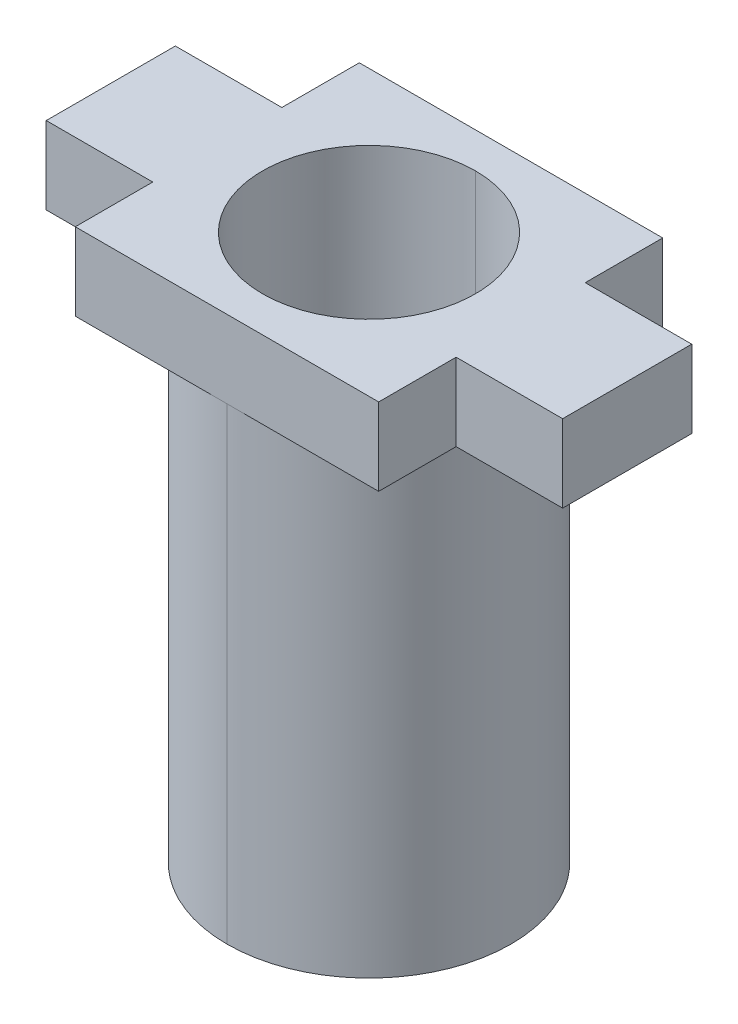
ISO-10303-21;
HEADER;
FILE_DESCRIPTION(('STEP AP214'),'2;1');
FILE_NAME('part.step','',(''),(''),'','','');
FILE_SCHEMA(('AUTOMOTIVE_DESIGN { 1 0 10303 214 1 1 1 1 }'));
ENDSEC;
DATA;
#1=APPLICATION_CONTEXT('core data for automotive mechanical design processes');
#2=APPLICATION_PROTOCOL_DEFINITION('international standard','automotive_design',2000,#1);
#3=PRODUCT_CONTEXT('',#1,'mechanical');
#4=PRODUCT('Part','Part','',(#3));
#5=PRODUCT_RELATED_PRODUCT_CATEGORY('part','',(#4));
#6=PRODUCT_DEFINITION_FORMATION('','',#4);
#7=PRODUCT_DEFINITION_CONTEXT('part definition',#1,'design');
#8=PRODUCT_DEFINITION('design','',#6,#7);
#9=PRODUCT_DEFINITION_SHAPE('','',#8);
#10=(LENGTH_UNIT() NAMED_UNIT(*) SI_UNIT(.MILLI.,.METRE.));
#11=(NAMED_UNIT(*) PLANE_ANGLE_UNIT() SI_UNIT($,.RADIAN.));
#12=(NAMED_UNIT(*) SI_UNIT($,.STERADIAN.) SOLID_ANGLE_UNIT());
#13=UNCERTAINTY_MEASURE_WITH_UNIT(LENGTH_MEASURE(1.E-05),#10,'distance_accuracy_value','');
#14=(GEOMETRIC_REPRESENTATION_CONTEXT(3) GLOBAL_UNCERTAINTY_ASSIGNED_CONTEXT((#13)) GLOBAL_UNIT_ASSIGNED_CONTEXT((#10,
#11,#12)) REPRESENTATION_CONTEXT('',''));
#15=CARTESIAN_POINT('',(0.,0.,0.));
#16=DIRECTION('',(0.,0.,1.));
#17=DIRECTION('',(1.,0.,0.));
#18=AXIS2_PLACEMENT_3D('',#15,#16,#17);
#19=CARTESIAN_POINT('',(-4.,8.45,-1.));
#20=DIRECTION('',(0.,0.,1.));
#21=DIRECTION('',(1.,0.,0.));
#22=AXIS2_PLACEMENT_3D('',#19,#20,#21);
#23=PLANE('',#22);
#24=DIRECTION('',(-1.,0.,0.));
#25=VECTOR('',#24,1.);
#26=CARTESIAN_POINT('',(-4.,7.25,-1.));
#27=LINE('',#26,#25);
#28=CARTESIAN_POINT('',(-2.35,7.25,-1.));
#29=VERTEX_POINT('',#28);
#30=CARTESIAN_POINT('',(-4.,7.25,-1.));
#31=VERTEX_POINT('',#30);
#32=EDGE_CURVE('E320',#29,#31,#27,.T.);
#33=ORIENTED_EDGE('',*,*,#32,.T.);
#34=DIRECTION('',(0.,-1.,0.));
#35=VECTOR('',#34,1.);
#36=CARTESIAN_POINT('',(-4.,8.45,-1.));
#37=LINE('',#36,#35);
#38=CARTESIAN_POINT('',(-4.,8.45,-1.));
#39=VERTEX_POINT('',#38);
#40=EDGE_CURVE('E290',#39,#31,#37,.T.);
#41=ORIENTED_EDGE('',*,*,#40,.F.);
#42=DIRECTION('',(-1.,0.,0.));
#43=VECTOR('',#42,1.);
#44=CARTESIAN_POINT('',(-4.,8.45,-1.));
#45=LINE('',#44,#43);
#46=CARTESIAN_POINT('',(-2.35,8.45,-1.));
#47=VERTEX_POINT('',#46);
#48=EDGE_CURVE('E262',#47,#39,#45,.T.);
#49=ORIENTED_EDGE('',*,*,#48,.F.);
#50=DIRECTION('',(0.,-1.,0.));
#51=VECTOR('',#50,1.);
#52=CARTESIAN_POINT('',(-2.35,8.45,-1.));
#53=LINE('',#52,#51);
#54=EDGE_CURVE('E11',#47,#29,#53,.T.);
#55=ORIENTED_EDGE('',*,*,#54,.T.);
#56=EDGE_LOOP('',(#33,#41,#49,#55));
#57=FACE_BOUND('',#56,.T.);
#58=ADVANCED_FACE('F17',(#57),#23,.F.);
#59=CARTESIAN_POINT('',(-2.35,8.45,-1.));
#60=DIRECTION('',(1.,0.,0.));
#61=DIRECTION('',(0.,1.,0.));
#62=AXIS2_PLACEMENT_3D('',#59,#60,#61);
#63=PLANE('',#62);
#64=DIRECTION('',(0.,0.,1.));
#65=VECTOR('',#64,1.);
#66=CARTESIAN_POINT('',(-2.35,7.25,-1.));
#67=LINE('',#66,#65);
#68=CARTESIAN_POINT('',(-2.35,7.25,-2.2));
#69=VERTEX_POINT('',#68);
#70=EDGE_CURVE('E291',#69,#29,#67,.T.);
#71=ORIENTED_EDGE('',*,*,#70,.T.);
#72=ORIENTED_EDGE('',*,*,#54,.F.);
#73=DIRECTION('',(0.,0.,1.));
#74=VECTOR('',#73,1.);
#75=CARTESIAN_POINT('',(-2.35,8.45,-1.));
#76=LINE('',#75,#74);
#77=CARTESIAN_POINT('',(-2.35,8.45,-2.2));
#78=VERTEX_POINT('',#77);
#79=EDGE_CURVE('E259',#78,#47,#76,.T.);
#80=ORIENTED_EDGE('',*,*,#79,.F.);
#81=DIRECTION('',(0.,-1.,0.));
#82=VECTOR('',#81,1.);
#83=CARTESIAN_POINT('',(-2.35,8.45,-2.2));
#84=LINE('',#83,#82);
#85=EDGE_CURVE('E28',#78,#69,#84,.T.);
#86=ORIENTED_EDGE('',*,*,#85,.T.);
#87=EDGE_LOOP('',(#71,#72,#80,#86));
#88=FACE_BOUND('',#87,.T.);
#89=ADVANCED_FACE('F376',(#88),#63,.F.);
#90=CARTESIAN_POINT('',(-2.35,8.45,-2.2));
#91=DIRECTION('',(0.,0.,1.));
#92=DIRECTION('',(1.,0.,0.));
#93=AXIS2_PLACEMENT_3D('',#90,#91,#92);
#94=PLANE('',#93);
#95=DIRECTION('',(-1.,0.,0.));
#96=VECTOR('',#95,1.);
#97=CARTESIAN_POINT('',(-2.35,7.25,-2.2));
#98=LINE('',#97,#96);
#99=CARTESIAN_POINT('',(2.35,7.25,-2.2));
#100=VERTEX_POINT('',#99);
#101=CARTESIAN_POINT('',(0.,7.25,-2.2));
#102=VERTEX_POINT('',#101);
#103=EDGE_CURVE('E198',#100,#102,#98,.T.);
#104=ORIENTED_EDGE('',*,*,#103,.T.);
#105=DIRECTION('',(-1.,0.,0.));
#106=VECTOR('',#105,1.);
#107=CARTESIAN_POINT('',(-2.35,7.25,-2.2));
#108=LINE('',#107,#106);
#109=EDGE_CURVE('E282',#102,#69,#108,.T.);
#110=ORIENTED_EDGE('',*,*,#109,.T.);
#111=ORIENTED_EDGE('',*,*,#85,.F.);
#112=DIRECTION('',(-1.,0.,0.));
#113=VECTOR('',#112,1.);
#114=CARTESIAN_POINT('',(-2.35,8.45,-2.2));
#115=LINE('',#114,#113);
#116=CARTESIAN_POINT('',(2.35,8.45,-2.2));
#117=VERTEX_POINT('',#116);
#118=EDGE_CURVE('E263',#117,#78,#115,.T.);
#119=ORIENTED_EDGE('',*,*,#118,.F.);
#120=DIRECTION('',(0.,-1.,0.));
#121=VECTOR('',#120,1.);
#122=CARTESIAN_POINT('',(2.35,8.45,-2.2));
#123=LINE('',#122,#121);
#124=EDGE_CURVE('E276',#117,#100,#123,.T.);
#125=ORIENTED_EDGE('',*,*,#124,.T.);
#126=EDGE_LOOP('',(#104,#110,#111,#119,#125));
#127=FACE_BOUND('',#126,.T.);
#128=ADVANCED_FACE('F381',(#127),#94,.F.);
#129=CARTESIAN_POINT('',(2.35,8.45,-2.2));
#130=DIRECTION('',(-1.,0.,0.));
#131=DIRECTION('',(0.,0.,1.));
#132=AXIS2_PLACEMENT_3D('',#129,#130,#131);
#133=PLANE('',#132);
#134=DIRECTION('',(0.,0.,-1.));
#135=VECTOR('',#134,1.);
#136=CARTESIAN_POINT('',(2.35,7.25,-2.2));
#137=LINE('',#136,#135);
#138=CARTESIAN_POINT('',(2.35,7.25,-1.));
#139=VERTEX_POINT('',#138);
#140=EDGE_CURVE('E191',#139,#100,#137,.T.);
#141=ORIENTED_EDGE('',*,*,#140,.T.);
#142=ORIENTED_EDGE('',*,*,#124,.F.);
#143=DIRECTION('',(0.,0.,-1.));
#144=VECTOR('',#143,1.);
#145=CARTESIAN_POINT('',(2.35,8.45,-2.2));
#146=LINE('',#145,#144);
#147=CARTESIAN_POINT('',(2.35,8.45,-1.));
#148=VERTEX_POINT('',#147);
#149=EDGE_CURVE('E295',#148,#117,#146,.T.);
#150=ORIENTED_EDGE('',*,*,#149,.F.);
#151=DIRECTION('',(0.,-1.,0.));
#152=VECTOR('',#151,1.);
#153=CARTESIAN_POINT('',(2.35,8.45,-1.));
#154=LINE('',#153,#152);
#155=EDGE_CURVE('E176',#148,#139,#154,.T.);
#156=ORIENTED_EDGE('',*,*,#155,.T.);
#157=EDGE_LOOP('',(#141,#142,#150,#156));
#158=FACE_BOUND('',#157,.T.);
#159=ADVANCED_FACE('F422',(#158),#133,.F.);
#160=CARTESIAN_POINT('',(2.35,8.45,-1.));
#161=DIRECTION('',(0.,0.,1.));
#162=DIRECTION('',(1.,0.,0.));
#163=AXIS2_PLACEMENT_3D('',#160,#161,#162);
#164=PLANE('',#163);
#165=DIRECTION('',(-1.,0.,0.));
#166=VECTOR('',#165,1.);
#167=CARTESIAN_POINT('',(2.35,7.25,-1.));
#168=LINE('',#167,#166);
#169=CARTESIAN_POINT('',(4.,7.25,-1.));
#170=VERTEX_POINT('',#169);
#171=EDGE_CURVE('E169',#170,#139,#168,.T.);
#172=ORIENTED_EDGE('',*,*,#171,.T.);
#173=ORIENTED_EDGE('',*,*,#155,.F.);
#174=DIRECTION('',(-1.,0.,0.));
#175=VECTOR('',#174,1.);
#176=CARTESIAN_POINT('',(2.35,8.45,-1.));
#177=LINE('',#176,#175);
#178=CARTESIAN_POINT('',(4.,8.45,-1.));
#179=VERTEX_POINT('',#178);
#180=EDGE_CURVE('E21',#179,#148,#177,.T.);
#181=ORIENTED_EDGE('',*,*,#180,.F.);
#182=DIRECTION('',(0.,-1.,0.));
#183=VECTOR('',#182,1.);
#184=CARTESIAN_POINT('',(4.,8.45,-1.));
#185=LINE('',#184,#183);
#186=EDGE_CURVE('E164',#179,#170,#185,.T.);
#187=ORIENTED_EDGE('',*,*,#186,.T.);
#188=EDGE_LOOP('',(#172,#173,#181,#187));
#189=FACE_BOUND('',#188,.T.);
#190=ADVANCED_FACE('F166',(#189),#164,.F.);
#191=CARTESIAN_POINT('',(4.,8.45,-1.));
#192=DIRECTION('',(-1.,0.,0.));
#193=DIRECTION('',(0.,1.,0.));
#194=AXIS2_PLACEMENT_3D('',#191,#192,#193);
#195=PLANE('',#194);
#196=DIRECTION('',(0.,0.,-1.));
#197=VECTOR('',#196,1.);
#198=CARTESIAN_POINT('',(4.,7.25,-1.));
#199=LINE('',#198,#197);
#200=CARTESIAN_POINT('',(4.,7.25,1.));
#201=VERTEX_POINT('',#200);
#202=EDGE_CURVE('E180',#201,#170,#199,.T.);
#203=ORIENTED_EDGE('',*,*,#202,.T.);
#204=ORIENTED_EDGE('',*,*,#186,.F.);
#205=DIRECTION('',(0.,0.,-1.));
#206=VECTOR('',#205,1.);
#207=CARTESIAN_POINT('',(4.,8.45,-1.));
#208=LINE('',#207,#206);
#209=CARTESIAN_POINT('',(4.,8.45,1.));
#210=VERTEX_POINT('',#209);
#211=EDGE_CURVE('E202',#210,#179,#208,.T.);
#212=ORIENTED_EDGE('',*,*,#211,.F.);
#213=DIRECTION('',(0.,-1.,0.));
#214=VECTOR('',#213,1.);
#215=CARTESIAN_POINT('',(4.,8.45,1.));
#216=LINE('',#215,#214);
#217=EDGE_CURVE('E177',#210,#201,#216,.T.);
#218=ORIENTED_EDGE('',*,*,#217,.T.);
#219=EDGE_LOOP('',(#203,#204,#212,#218));
#220=FACE_BOUND('',#219,.T.);
#221=ADVANCED_FACE('F181',(#220),#195,.F.);
#222=CARTESIAN_POINT('',(4.,8.45,1.));
#223=DIRECTION('',(0.,0.,-1.));
#224=DIRECTION('',(-1.,0.,0.));
#225=AXIS2_PLACEMENT_3D('',#222,#223,#224);
#226=PLANE('',#225);
#227=DIRECTION('',(1.,0.,0.));
#228=VECTOR('',#227,1.);
#229=CARTESIAN_POINT('',(4.,7.25,1.));
#230=LINE('',#229,#228);
#231=CARTESIAN_POINT('',(2.35,7.25,1.));
#232=VERTEX_POINT('',#231);
#233=EDGE_CURVE('E186',#232,#201,#230,.T.);
#234=ORIENTED_EDGE('',*,*,#233,.T.);
#235=ORIENTED_EDGE('',*,*,#217,.F.);
#236=DIRECTION('',(1.,0.,0.));
#237=VECTOR('',#236,1.);
#238=CARTESIAN_POINT('',(4.,8.45,1.));
#239=LINE('',#238,#237);
#240=CARTESIAN_POINT('',(2.35,8.45,1.));
#241=VERTEX_POINT('',#240);
#242=EDGE_CURVE('E204',#241,#210,#239,.T.);
#243=ORIENTED_EDGE('',*,*,#242,.F.);
#244=DIRECTION('',(0.,-1.,0.));
#245=VECTOR('',#244,1.);
#246=CARTESIAN_POINT('',(2.35,8.45,1.));
#247=LINE('',#246,#245);
#248=EDGE_CURVE('E248',#241,#232,#247,.T.);
#249=ORIENTED_EDGE('',*,*,#248,.T.);
#250=EDGE_LOOP('',(#234,#235,#243,#249));
#251=FACE_BOUND('',#250,.T.);
#252=ADVANCED_FACE('F389',(#251),#226,.F.);
#253=CARTESIAN_POINT('',(2.35,8.45,1.));
#254=DIRECTION('',(-1.,0.,0.));
#255=DIRECTION('',(0.,0.,1.));
#256=AXIS2_PLACEMENT_3D('',#253,#254,#255);
#257=PLANE('',#256);
#258=DIRECTION('',(0.,0.,-1.));
#259=VECTOR('',#258,1.);
#260=CARTESIAN_POINT('',(2.35,7.25,1.));
#261=LINE('',#260,#259);
#262=CARTESIAN_POINT('',(2.35,7.25,2.2));
#263=VERTEX_POINT('',#262);
#264=EDGE_CURVE('E258',#263,#232,#261,.T.);
#265=ORIENTED_EDGE('',*,*,#264,.T.);
#266=ORIENTED_EDGE('',*,*,#248,.F.);
#267=DIRECTION('',(0.,0.,-1.));
#268=VECTOR('',#267,1.);
#269=CARTESIAN_POINT('',(2.35,8.45,1.));
#270=LINE('',#269,#268);
#271=CARTESIAN_POINT('',(2.35,8.45,2.2));
#272=VERTEX_POINT('',#271);
#273=EDGE_CURVE('E275',#272,#241,#270,.T.);
#274=ORIENTED_EDGE('',*,*,#273,.F.);
#275=DIRECTION('',(0.,-1.,0.));
#276=VECTOR('',#275,1.);
#277=CARTESIAN_POINT('',(2.35,8.45,2.2));
#278=LINE('',#277,#276);
#279=EDGE_CURVE('E144',#272,#263,#278,.T.);
#280=ORIENTED_EDGE('',*,*,#279,.T.);
#281=EDGE_LOOP('',(#265,#266,#274,#280));
#282=FACE_BOUND('',#281,.T.);
#283=ADVANCED_FACE('F447',(#282),#257,.F.);
#284=CARTESIAN_POINT('',(2.35,8.45,2.2));
#285=DIRECTION('',(0.,0.,-1.));
#286=DIRECTION('',(0.,-1.,0.));
#287=AXIS2_PLACEMENT_3D('',#284,#285,#286);
#288=PLANE('',#287);
#289=DIRECTION('',(1.,0.,0.));
#290=VECTOR('',#289,1.);
#291=CARTESIAN_POINT('',(2.35,7.25,2.2));
#292=LINE('',#291,#290);
#293=CARTESIAN_POINT('',(-2.35,7.25,2.2));
#294=VERTEX_POINT('',#293);
#295=CARTESIAN_POINT('',(0.,7.25,2.2));
#296=VERTEX_POINT('',#295);
#297=EDGE_CURVE('E323',#294,#296,#292,.T.);
#298=ORIENTED_EDGE('',*,*,#297,.T.);
#299=DIRECTION('',(1.,0.,0.));
#300=VECTOR('',#299,1.);
#301=CARTESIAN_POINT('',(2.35,7.25,2.2));
#302=LINE('',#301,#300);
#303=EDGE_CURVE('E268',#296,#263,#302,.T.);
#304=ORIENTED_EDGE('',*,*,#303,.T.);
#305=ORIENTED_EDGE('',*,*,#279,.F.);
#306=DIRECTION('',(1.,0.,0.));
#307=VECTOR('',#306,1.);
#308=CARTESIAN_POINT('',(2.35,8.45,2.2));
#309=LINE('',#308,#307);
#310=CARTESIAN_POINT('',(-2.35,8.45,2.2));
#311=VERTEX_POINT('',#310);
#312=EDGE_CURVE('E254',#311,#272,#309,.T.);
#313=ORIENTED_EDGE('',*,*,#312,.F.);
#314=DIRECTION('',(0.,-1.,0.));
#315=VECTOR('',#314,1.);
#316=CARTESIAN_POINT('',(-2.35,8.45,2.2));
#317=LINE('',#316,#315);
#318=EDGE_CURVE('E133',#311,#294,#317,.T.);
#319=ORIENTED_EDGE('',*,*,#318,.T.);
#320=EDGE_LOOP('',(#298,#304,#305,#313,#319));
#321=FACE_BOUND('',#320,.T.);
#322=ADVANCED_FACE('F371',(#321),#288,.F.);
#323=CARTESIAN_POINT('',(-2.35,8.45,2.2));
#324=DIRECTION('',(1.,0.,0.));
#325=DIRECTION('',(0.,1.,0.));
#326=AXIS2_PLACEMENT_3D('',#323,#324,#325);
#327=PLANE('',#326);
#328=DIRECTION('',(0.,0.,1.));
#329=VECTOR('',#328,1.);
#330=CARTESIAN_POINT('',(-2.35,7.25,2.2));
#331=LINE('',#330,#329);
#332=CARTESIAN_POINT('',(-2.35,7.25,1.));
#333=VERTEX_POINT('',#332);
#334=EDGE_CURVE('E312',#333,#294,#331,.T.);
#335=ORIENTED_EDGE('',*,*,#334,.T.);
#336=ORIENTED_EDGE('',*,*,#318,.F.);
#337=DIRECTION('',(0.,0.,1.));
#338=VECTOR('',#337,1.);
#339=CARTESIAN_POINT('',(-2.35,8.45,2.2));
#340=LINE('',#339,#338);
#341=CARTESIAN_POINT('',(-2.35,8.45,1.));
#342=VERTEX_POINT('',#341);
#343=EDGE_CURVE('E250',#342,#311,#340,.T.);
#344=ORIENTED_EDGE('',*,*,#343,.F.);
#345=DIRECTION('',(0.,-1.,0.));
#346=VECTOR('',#345,1.);
#347=CARTESIAN_POINT('',(-2.35,8.45,1.));
#348=LINE('',#347,#346);
#349=EDGE_CURVE('E124',#342,#333,#348,.T.);
#350=ORIENTED_EDGE('',*,*,#349,.T.);
#351=EDGE_LOOP('',(#335,#336,#344,#350));
#352=FACE_BOUND('',#351,.T.);
#353=ADVANCED_FACE('F362',(#352),#327,.F.);
#354=CARTESIAN_POINT('',(-2.35,8.45,1.));
#355=DIRECTION('',(0.,0.,-1.));
#356=DIRECTION('',(0.,-1.,0.));
#357=AXIS2_PLACEMENT_3D('',#354,#355,#356);
#358=PLANE('',#357);
#359=DIRECTION('',(1.,0.,0.));
#360=VECTOR('',#359,1.);
#361=CARTESIAN_POINT('',(-2.35,7.25,1.));
#362=LINE('',#361,#360);
#363=CARTESIAN_POINT('',(-4.,7.25,1.));
#364=VERTEX_POINT('',#363);
#365=EDGE_CURVE('E308',#364,#333,#362,.T.);
#366=ORIENTED_EDGE('',*,*,#365,.T.);
#367=ORIENTED_EDGE('',*,*,#349,.F.);
#368=DIRECTION('',(1.,0.,0.));
#369=VECTOR('',#368,1.);
#370=CARTESIAN_POINT('',(-2.35,8.45,1.));
#371=LINE('',#370,#369);
#372=CARTESIAN_POINT('',(-4.,8.45,1.));
#373=VERTEX_POINT('',#372);
#374=EDGE_CURVE('E255',#373,#342,#371,.T.);
#375=ORIENTED_EDGE('',*,*,#374,.F.);
#376=DIRECTION('',(0.,-1.,0.));
#377=VECTOR('',#376,1.);
#378=CARTESIAN_POINT('',(-4.,8.45,1.));
#379=LINE('',#378,#377);
#380=EDGE_CURVE('E286',#373,#364,#379,.T.);
#381=ORIENTED_EDGE('',*,*,#380,.T.);
#382=EDGE_LOOP('',(#366,#367,#375,#381));
#383=FACE_BOUND('',#382,.T.);
#384=ADVANCED_FACE('F359',(#383),#358,.F.);
#385=CARTESIAN_POINT('',(-4.,8.45,1.));
#386=DIRECTION('',(1.,0.,0.));
#387=DIRECTION('',(0.,1.,0.));
#388=AXIS2_PLACEMENT_3D('',#385,#386,#387);
#389=PLANE('',#388);
#390=DIRECTION('',(0.,0.,1.));
#391=VECTOR('',#390,1.);
#392=CARTESIAN_POINT('',(-4.,7.25,1.));
#393=LINE('',#392,#391);
#394=EDGE_CURVE('E311',#31,#364,#393,.T.);
#395=ORIENTED_EDGE('',*,*,#394,.T.);
#396=ORIENTED_EDGE('',*,*,#380,.F.);
#397=DIRECTION('',(0.,0.,1.));
#398=VECTOR('',#397,1.);
#399=CARTESIAN_POINT('',(-4.,8.45,1.));
#400=LINE('',#399,#398);
#401=EDGE_CURVE('E299',#39,#373,#400,.T.);
#402=ORIENTED_EDGE('',*,*,#401,.F.);
#403=ORIENTED_EDGE('',*,*,#40,.T.);
#404=EDGE_LOOP('',(#395,#396,#402,#403));
#405=FACE_BOUND('',#404,.T.);
#406=ADVANCED_FACE('F356',(#405),#389,.F.);
#407=CARTESIAN_POINT('',(0.,7.25,0.));
#408=DIRECTION('',(0.,-1.,0.));
#409=DIRECTION('',(0.,0.,-1.));
#410=AXIS2_PLACEMENT_3D('',#407,#408,#409);
#411=PLANE('',#410);
#412=ORIENTED_EDGE('',*,*,#109,.F.);
#413=CARTESIAN_POINT('',(0.,7.25,0.));
#414=DIRECTION('',(0.,1.,0.));
#415=DIRECTION('',(0.,0.,1.));
#416=AXIS2_PLACEMENT_3D('',#413,#414,#415);
#417=CIRCLE('',#416,2.2);
#418=EDGE_CURVE('E239',#102,#296,#417,.T.);
#419=ORIENTED_EDGE('',*,*,#418,.T.);
#420=ORIENTED_EDGE('',*,*,#297,.F.);
#421=ORIENTED_EDGE('',*,*,#334,.F.);
#422=ORIENTED_EDGE('',*,*,#365,.F.);
#423=ORIENTED_EDGE('',*,*,#394,.F.);
#424=ORIENTED_EDGE('',*,*,#32,.F.);
#425=ORIENTED_EDGE('',*,*,#70,.F.);
#426=EDGE_LOOP('',(#412,#419,#420,#421,#422,#423,#424,#425));
#427=FACE_BOUND('',#426,.T.);
#428=ADVANCED_FACE('F369',(#427),#411,.T.);
#429=CARTESIAN_POINT('',(0.,8.45,0.));
#430=DIRECTION('',(0.,-1.,0.));
#431=DIRECTION('',(0.,0.,-1.));
#432=AXIS2_PLACEMENT_3D('',#429,#430,#431);
#433=PLANE('',#432);
#434=CARTESIAN_POINT('',(0.,8.45,0.));
#435=DIRECTION('',(0.,1.,0.));
#436=DIRECTION('',(0.,0.,1.));
#437=AXIS2_PLACEMENT_3D('',#434,#435,#436);
#438=CIRCLE('',#437,1.65);
#439=CARTESIAN_POINT('',(0.,8.45,1.65));
#440=VERTEX_POINT('',#439);
#441=CARTESIAN_POINT('',(0.,8.45,-1.65));
#442=VERTEX_POINT('',#441);
#443=EDGE_CURVE('E271',#440,#442,#438,.T.);
#444=ORIENTED_EDGE('',*,*,#443,.F.);
#445=CARTESIAN_POINT('',(0.,8.45,0.));
#446=DIRECTION('',(0.,1.,0.));
#447=DIRECTION('',(0.,0.,1.));
#448=AXIS2_PLACEMENT_3D('',#445,#446,#447);
#449=CIRCLE('',#448,1.65);
#450=EDGE_CURVE('E215',#442,#440,#449,.T.);
#451=ORIENTED_EDGE('',*,*,#450,.F.);
#452=EDGE_LOOP('',(#444,#451));
#453=FACE_BOUND('',#452,.T.);
#454=ORIENTED_EDGE('',*,*,#401,.T.);
#455=ORIENTED_EDGE('',*,*,#374,.T.);
#456=ORIENTED_EDGE('',*,*,#343,.T.);
#457=ORIENTED_EDGE('',*,*,#312,.T.);
#458=ORIENTED_EDGE('',*,*,#273,.T.);
#459=ORIENTED_EDGE('',*,*,#242,.T.);
#460=ORIENTED_EDGE('',*,*,#211,.T.);
#461=ORIENTED_EDGE('',*,*,#180,.T.);
#462=ORIENTED_EDGE('',*,*,#149,.T.);
#463=ORIENTED_EDGE('',*,*,#118,.T.);
#464=ORIENTED_EDGE('',*,*,#79,.T.);
#465=ORIENTED_EDGE('',*,*,#48,.T.);
#466=EDGE_LOOP('',(#454,#455,#456,#457,#458,#459,#460,#461,#462,#463,#464,#465));
#467=FACE_BOUND('',#466,.T.);
#468=ADVANCED_FACE('F19',(#453,#467),#433,.F.);
#469=CARTESIAN_POINT('',(0.,7.25,0.));
#470=DIRECTION('',(0.,-1.,0.));
#471=DIRECTION('',(0.,0.,-1.));
#472=AXIS2_PLACEMENT_3D('',#469,#470,#471);
#473=PLANE('',#472);
#474=ORIENTED_EDGE('',*,*,#303,.F.);
#475=CARTESIAN_POINT('',(0.,7.25,0.));
#476=DIRECTION('',(0.,1.,0.));
#477=DIRECTION('',(0.,0.,1.));
#478=AXIS2_PLACEMENT_3D('',#475,#476,#477);
#479=CIRCLE('',#478,2.2);
#480=EDGE_CURVE('E214',#296,#102,#479,.T.);
#481=ORIENTED_EDGE('',*,*,#480,.T.);
#482=ORIENTED_EDGE('',*,*,#103,.F.);
#483=ORIENTED_EDGE('',*,*,#140,.F.);
#484=ORIENTED_EDGE('',*,*,#171,.F.);
#485=ORIENTED_EDGE('',*,*,#202,.F.);
#486=ORIENTED_EDGE('',*,*,#233,.F.);
#487=ORIENTED_EDGE('',*,*,#264,.F.);
#488=EDGE_LOOP('',(#474,#481,#482,#483,#484,#485,#486,#487));
#489=FACE_BOUND('',#488,.T.);
#490=ADVANCED_FACE('F188',(#489),#473,.T.);
#491=CARTESIAN_POINT('',(0.,0.,0.));
#492=DIRECTION('',(0.,1.,0.));
#493=DIRECTION('',(0.,0.,1.));
#494=AXIS2_PLACEMENT_3D('',#491,#492,#493);
#495=CYLINDRICAL_SURFACE('',#494,1.65);
#496=DIRECTION('',(0.,1.,0.));
#497=VECTOR('',#496,1.);
#498=CARTESIAN_POINT('',(0.,0.,-1.65));
#499=LINE('',#498,#497);
#500=CARTESIAN_POINT('',(0.,0.,-1.65));
#501=VERTEX_POINT('',#500);
#502=EDGE_CURVE('E226',#501,#442,#499,.T.);
#503=ORIENTED_EDGE('',*,*,#502,.F.);
#504=CARTESIAN_POINT('',(0.,0.,0.));
#505=DIRECTION('',(0.,1.,0.));
#506=DIRECTION('',(0.,0.,1.));
#507=AXIS2_PLACEMENT_3D('',#504,#505,#506);
#508=CIRCLE('',#507,1.65);
#509=CARTESIAN_POINT('',(0.,0.,1.65));
#510=VERTEX_POINT('',#509);
#511=EDGE_CURVE('E246',#510,#501,#508,.T.);
#512=ORIENTED_EDGE('',*,*,#511,.F.);
#513=DIRECTION('',(0.,1.,0.));
#514=VECTOR('',#513,1.);
#515=CARTESIAN_POINT('',(0.,0.,1.65));
#516=LINE('',#515,#514);
#517=EDGE_CURVE('E211',#510,#440,#516,.T.);
#518=ORIENTED_EDGE('',*,*,#517,.T.);
#519=ORIENTED_EDGE('',*,*,#443,.T.);
#520=EDGE_LOOP('',(#503,#512,#518,#519));
#521=FACE_BOUND('',#520,.T.);
#522=ADVANCED_FACE('F387',(#521),#495,.F.);
#523=CARTESIAN_POINT('',(0.,0.,0.));
#524=DIRECTION('',(0.,1.,0.));
#525=DIRECTION('',(1.,0.,0.));
#526=AXIS2_PLACEMENT_3D('',#523,#524,#525);
#527=PLANE('',#526);
#528=ORIENTED_EDGE('',*,*,#511,.T.);
#529=CARTESIAN_POINT('',(0.,0.,0.));
#530=DIRECTION('',(0.,1.,0.));
#531=DIRECTION('',(0.,0.,1.));
#532=AXIS2_PLACEMENT_3D('',#529,#530,#531);
#533=CIRCLE('',#532,1.65);
#534=EDGE_CURVE('E235',#501,#510,#533,.T.);
#535=ORIENTED_EDGE('',*,*,#534,.T.);
#536=EDGE_LOOP('',(#528,#535));
#537=FACE_BOUND('',#536,.T.);
#538=CARTESIAN_POINT('',(0.,0.,0.));
#539=DIRECTION('',(0.,1.,0.));
#540=DIRECTION('',(0.,0.,1.));
#541=AXIS2_PLACEMENT_3D('',#538,#539,#540);
#542=CIRCLE('',#541,2.2);
#543=CARTESIAN_POINT('',(0.,0.,-2.2));
#544=VERTEX_POINT('',#543);
#545=CARTESIAN_POINT('',(0.,0.,2.2));
#546=VERTEX_POINT('',#545);
#547=EDGE_CURVE('E242',#544,#546,#542,.T.);
#548=ORIENTED_EDGE('',*,*,#547,.F.);
#549=CARTESIAN_POINT('',(0.,0.,0.));
#550=DIRECTION('',(0.,1.,0.));
#551=DIRECTION('',(0.,0.,1.));
#552=AXIS2_PLACEMENT_3D('',#549,#550,#551);
#553=CIRCLE('',#552,2.2);
#554=EDGE_CURVE('E205',#546,#544,#553,.T.);
#555=ORIENTED_EDGE('',*,*,#554,.F.);
#556=EDGE_LOOP('',(#548,#555));
#557=FACE_BOUND('',#556,.T.);
#558=ADVANCED_FACE('F393',(#537,#557),#527,.F.);
#559=CARTESIAN_POINT('',(0.,7.25,0.));
#560=DIRECTION('',(0.,-1.,0.));
#561=DIRECTION('',(0.,0.,-1.));
#562=AXIS2_PLACEMENT_3D('',#559,#560,#561);
#563=CYLINDRICAL_SURFACE('',#562,2.2);
#564=DIRECTION('',(0.,-1.,0.));
#565=VECTOR('',#564,1.);
#566=CARTESIAN_POINT('',(0.,7.25,2.2));
#567=LINE('',#566,#565);
#568=EDGE_CURVE('E210',#296,#546,#567,.T.);
#569=ORIENTED_EDGE('',*,*,#568,.F.);
#570=ORIENTED_EDGE('',*,*,#418,.F.);
#571=DIRECTION('',(0.,-1.,0.));
#572=VECTOR('',#571,1.);
#573=CARTESIAN_POINT('',(0.,7.25,-2.2));
#574=LINE('',#573,#572);
#575=EDGE_CURVE('E209',#102,#544,#574,.T.);
#576=ORIENTED_EDGE('',*,*,#575,.T.);
#577=ORIENTED_EDGE('',*,*,#547,.T.);
#578=EDGE_LOOP('',(#569,#570,#576,#577));
#579=FACE_BOUND('',#578,.T.);
#580=ADVANCED_FACE('F390',(#579),#563,.T.);
#581=CARTESIAN_POINT('',(0.,7.25,0.));
#582=DIRECTION('',(0.,-1.,0.));
#583=DIRECTION('',(0.,0.,-1.));
#584=AXIS2_PLACEMENT_3D('',#581,#582,#583);
#585=CYLINDRICAL_SURFACE('',#584,2.2);
#586=ORIENTED_EDGE('',*,*,#480,.F.);
#587=ORIENTED_EDGE('',*,*,#568,.T.);
#588=ORIENTED_EDGE('',*,*,#554,.T.);
#589=ORIENTED_EDGE('',*,*,#575,.F.);
#590=EDGE_LOOP('',(#586,#587,#588,#589));
#591=FACE_BOUND('',#590,.T.);
#592=ADVANCED_FACE('F392',(#591),#585,.T.);
#593=CARTESIAN_POINT('',(0.,0.,0.));
#594=DIRECTION('',(0.,1.,0.));
#595=DIRECTION('',(0.,0.,1.));
#596=AXIS2_PLACEMENT_3D('',#593,#594,#595);
#597=CYLINDRICAL_SURFACE('',#596,1.65);
#598=ORIENTED_EDGE('',*,*,#534,.F.);
#599=ORIENTED_EDGE('',*,*,#502,.T.);
#600=ORIENTED_EDGE('',*,*,#450,.T.);
#601=ORIENTED_EDGE('',*,*,#517,.F.);
#602=EDGE_LOOP('',(#598,#599,#600,#601));
#603=FACE_BOUND('',#602,.T.);
#604=ADVANCED_FACE('F399',(#603),#597,.F.);
#605=CLOSED_SHELL('',(#58,#89,#128,#159,#190,#221,#252,#283,#322,#353,#384,#406,#428,#468,#490,
#522,#558,#580,#592,#604));
#606=MANIFOLD_SOLID_BREP('B1',#605);
#607=ADVANCED_BREP_SHAPE_REPRESENTATION('',(#18,#606),#14);
#608=SHAPE_DEFINITION_REPRESENTATION(#9,#607);
ENDSEC;
END-ISO-10303-21;
